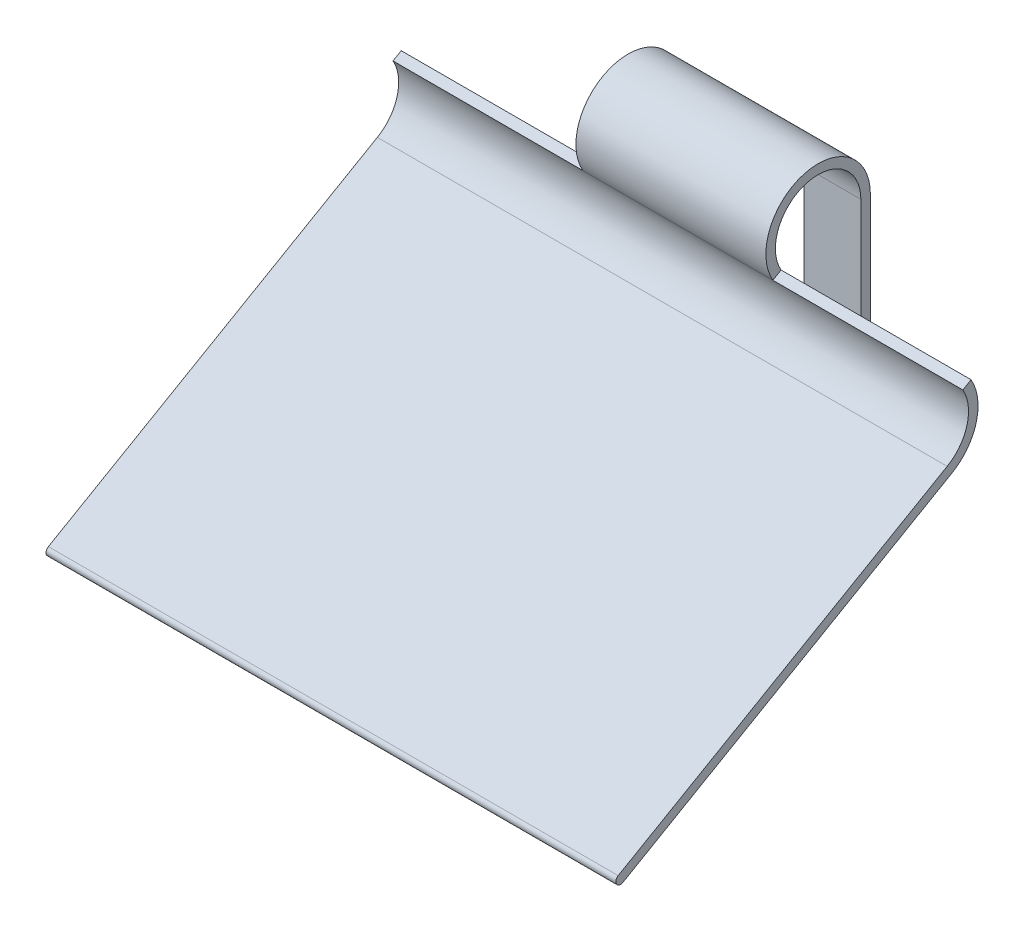
ISO-10303-21;
HEADER;
FILE_DESCRIPTION(('STEP AP214'),'2;1');
FILE_NAME('part.step','',(''),(''),'','','');
FILE_SCHEMA(('AUTOMOTIVE_DESIGN { 1 0 10303 214 1 1 1 1 }'));
ENDSEC;
DATA;
#1=APPLICATION_CONTEXT('core data for automotive mechanical design processes');
#2=APPLICATION_PROTOCOL_DEFINITION('international standard','automotive_design',2000,#1);
#3=PRODUCT_CONTEXT('',#1,'mechanical');
#4=PRODUCT('Part','Part','',(#3));
#5=PRODUCT_RELATED_PRODUCT_CATEGORY('part','',(#4));
#6=PRODUCT_DEFINITION_FORMATION('','',#4);
#7=PRODUCT_DEFINITION_CONTEXT('part definition',#1,'design');
#8=PRODUCT_DEFINITION('design','',#6,#7);
#9=PRODUCT_DEFINITION_SHAPE('','',#8);
#10=(LENGTH_UNIT() NAMED_UNIT(*) SI_UNIT(.MILLI.,.METRE.));
#11=(NAMED_UNIT(*) PLANE_ANGLE_UNIT() SI_UNIT($,.RADIAN.));
#12=(NAMED_UNIT(*) SI_UNIT($,.STERADIAN.) SOLID_ANGLE_UNIT());
#13=UNCERTAINTY_MEASURE_WITH_UNIT(LENGTH_MEASURE(1.E-05),#10,'distance_accuracy_value','');
#14=(GEOMETRIC_REPRESENTATION_CONTEXT(3) GLOBAL_UNCERTAINTY_ASSIGNED_CONTEXT((#13)) GLOBAL_UNIT_ASSIGNED_CONTEXT((#10,
#11,#12)) REPRESENTATION_CONTEXT('',''));
#15=CARTESIAN_POINT('',(0.,0.,0.));
#16=DIRECTION('',(0.,0.,1.));
#17=DIRECTION('',(1.,0.,0.));
#18=AXIS2_PLACEMENT_3D('',#15,#16,#17);
#19=CARTESIAN_POINT('',(-25.4,-50.7985098448101,-28.3470452561249));
#20=DIRECTION('',(1.,0.,0.));
#21=DIRECTION('',(0.,0.,-1.));
#22=AXIS2_PLACEMENT_3D('',#19,#20,#21);
#23=CYLINDRICAL_SURFACE('',#22,1.27);
#24=DIRECTION('',(1.,0.,0.));
#25=VECTOR('',#24,1.);
#26=CARTESIAN_POINT('',(-25.4,-50.7985098448101,-27.0770452561249));
#27=LINE('',#26,#25);
#28=CARTESIAN_POINT('',(10.16,-50.7985098448101,-27.0770452561249));
#29=VERTEX_POINT('',#28);
#30=CARTESIAN_POINT('',(25.4,-50.7985098448101,-27.0770452561249));
#31=VERTEX_POINT('',#30);
#32=EDGE_CURVE('E300',#29,#31,#27,.T.);
#33=ORIENTED_EDGE('',*,*,#32,.F.);
#34=CARTESIAN_POINT('',(10.16,-50.7985098448101,-28.3470452561249));
#35=DIRECTION('',(1.,0.,0.));
#36=DIRECTION('',(0.,1.,0.));
#37=AXIS2_PLACEMENT_3D('',#34,#35,#36);
#38=CIRCLE('',#37,1.27);
#39=CARTESIAN_POINT('',(10.16,-50.7985098448101,-29.6170452561249));
#40=VERTEX_POINT('',#39);
#41=EDGE_CURVE('E317',#29,#40,#38,.T.);
#42=ORIENTED_EDGE('',*,*,#41,.T.);
#43=DIRECTION('',(1.,0.,0.));
#44=VECTOR('',#43,1.);
#45=CARTESIAN_POINT('',(-25.4,-50.7985098448101,-29.6170452561249));
#46=LINE('',#45,#44);
#47=CARTESIAN_POINT('',(25.4,-50.7985098448101,-29.6170452561249));
#48=VERTEX_POINT('',#47);
#49=EDGE_CURVE('E190',#40,#48,#46,.T.);
#50=ORIENTED_EDGE('',*,*,#49,.T.);
#51=CARTESIAN_POINT('',(25.4,-50.7985098448101,-28.3470452561249));
#52=DIRECTION('',(1.,0.,0.));
#53=DIRECTION('',(0.,0.,-1.));
#54=AXIS2_PLACEMENT_3D('',#51,#52,#53);
#55=CIRCLE('',#54,1.27);
#56=EDGE_CURVE('E319',#48,#31,#55,.F.);
#57=ORIENTED_EDGE('',*,*,#56,.T.);
#58=EDGE_LOOP('',(#33,#42,#50,#57));
#59=FACE_BOUND('',#58,.T.);
#60=ADVANCED_FACE('F41',(#59),#23,.T.);
#61=CARTESIAN_POINT('',(-25.4,0.,-27.0770452561249));
#62=DIRECTION('',(0.,0.,1.));
#63=DIRECTION('',(1.,0.,0.));
#64=AXIS2_PLACEMENT_3D('',#61,#62,#63);
#65=PLANE('',#64);
#66=DIRECTION('',(0.,1.,0.));
#67=VECTOR('',#66,1.);
#68=CARTESIAN_POINT('',(10.16,0.,-27.0770452561249));
#69=LINE('',#68,#67);
#70=CARTESIAN_POINT('',(10.16,23.6985226280623,-27.0770452561249));
#71=VERTEX_POINT('',#70);
#72=EDGE_CURVE('E314',#29,#71,#69,.T.);
#73=ORIENTED_EDGE('',*,*,#72,.F.);
#74=ORIENTED_EDGE('',*,*,#32,.T.);
#75=DIRECTION('',(0.,-1.,0.));
#76=VECTOR('',#75,1.);
#77=CARTESIAN_POINT('',(25.4,0.,-27.0770452561249));
#78=LINE('',#77,#76);
#79=CARTESIAN_POINT('',(25.4,23.6985226280623,-27.0770452561249));
#80=VERTEX_POINT('',#79);
#81=EDGE_CURVE('E276',#80,#31,#78,.T.);
#82=ORIENTED_EDGE('',*,*,#81,.F.);
#83=DIRECTION('',(1.,0.,0.));
#84=VECTOR('',#83,1.);
#85=CARTESIAN_POINT('',(-25.4,23.6985226280623,-27.0770452561249));
#86=LINE('',#85,#84);
#87=EDGE_CURVE('E303',#71,#80,#86,.T.);
#88=ORIENTED_EDGE('',*,*,#87,.F.);
#89=EDGE_LOOP('',(#73,#74,#82,#88));
#90=FACE_BOUND('',#89,.T.);
#91=ADVANCED_FACE('F312',(#90),#65,.T.);
#92=CARTESIAN_POINT('',(-25.4,0.,-29.6170452561249));
#93=DIRECTION('',(0.,0.,1.));
#94=DIRECTION('',(1.,0.,0.));
#95=AXIS2_PLACEMENT_3D('',#92,#93,#94);
#96=PLANE('',#95);
#97=ORIENTED_EDGE('',*,*,#49,.F.);
#98=DIRECTION('',(0.,-1.,0.));
#99=VECTOR('',#98,1.);
#100=CARTESIAN_POINT('',(10.16,-50.7985098448101,-29.6170452561249));
#101=LINE('',#100,#99);
#102=CARTESIAN_POINT('',(10.16,23.6985226280623,-29.6170452561249));
#103=VERTEX_POINT('',#102);
#104=EDGE_CURVE('E164',#103,#40,#101,.T.);
#105=ORIENTED_EDGE('',*,*,#104,.F.);
#106=DIRECTION('',(1.,0.,0.));
#107=VECTOR('',#106,1.);
#108=CARTESIAN_POINT('',(-25.4,23.6985226280623,-29.6170452561249));
#109=LINE('',#108,#107);
#110=CARTESIAN_POINT('',(25.4,23.6985226280623,-29.6170452561249));
#111=VERTEX_POINT('',#110);
#112=EDGE_CURVE('E178',#103,#111,#109,.T.);
#113=ORIENTED_EDGE('',*,*,#112,.T.);
#114=DIRECTION('',(0.,-1.,0.));
#115=VECTOR('',#114,1.);
#116=CARTESIAN_POINT('',(25.4,0.,-29.6170452561249));
#117=LINE('',#116,#115);
#118=EDGE_CURVE('E278',#111,#48,#117,.T.);
#119=ORIENTED_EDGE('',*,*,#118,.T.);
#120=EDGE_LOOP('',(#97,#105,#113,#119));
#121=FACE_BOUND('',#120,.T.);
#122=ADVANCED_FACE('F334',(#121),#96,.F.);
#123=CARTESIAN_POINT('',(-76.2,10.9985226280624,6.34999999999994));
#124=DIRECTION('',(0.,-0.866025403784442,-0.499999999999995));
#125=DIRECTION('',(0.,0.499999999999995,-0.866025403784442));
#126=AXIS2_PLACEMENT_3D('',#123,#124,#125);
#127=PLANE('',#126);
#128=DIRECTION('',(0.,0.499999999999995,-0.866025403784442));
#129=VECTOR('',#128,1.);
#130=CARTESIAN_POINT('',(-25.4,10.9985226280624,6.34999999999994));
#131=LINE('',#130,#129);
#132=CARTESIAN_POINT('',(-25.4,16.7135226280624,-3.54867036525622));
#133=VERTEX_POINT('',#132);
#134=CARTESIAN_POINT('',(-25.4,17.9835226280623,-5.74837489086871));
#135=VERTEX_POINT('',#134);
#136=EDGE_CURVE('E289',#133,#135,#131,.T.);
#137=ORIENTED_EDGE('',*,*,#136,.T.);
#138=DIRECTION('',(1.,0.,0.));
#139=VECTOR('',#138,1.);
#140=CARTESIAN_POINT('',(-76.2,17.9835226280623,-5.74837489086871));
#141=LINE('',#140,#139);
#142=CARTESIAN_POINT('',(-76.2,17.9835226280623,-5.74837489086871));
#143=VERTEX_POINT('',#142);
#144=EDGE_CURVE('E231',#143,#135,#141,.T.);
#145=ORIENTED_EDGE('',*,*,#144,.F.);
#146=DIRECTION('',(0.,0.499999999999995,-0.866025403784442));
#147=VECTOR('',#146,1.);
#148=CARTESIAN_POINT('',(-76.2,10.9985226280624,6.34999999999994));
#149=LINE('',#148,#147);
#150=CARTESIAN_POINT('',(-76.2,16.7135226280624,-3.54867036525622));
#151=VERTEX_POINT('',#150);
#152=EDGE_CURVE('E221',#151,#143,#149,.T.);
#153=ORIENTED_EDGE('',*,*,#152,.F.);
#154=DIRECTION('',(1.,0.,0.));
#155=VECTOR('',#154,1.);
#156=CARTESIAN_POINT('',(-76.2,16.7135226280624,-3.54867036525622));
#157=LINE('',#156,#155);
#158=EDGE_CURVE('E227',#151,#133,#157,.T.);
#159=ORIENTED_EDGE('',*,*,#158,.T.);
#160=EDGE_LOOP('',(#137,#145,#153,#159));
#161=FACE_BOUND('',#160,.T.);
#162=ADVANCED_FACE('F337',(#161),#127,.F.);
#163=CARTESIAN_POINT('',(-76.2,1.09985226280624,0.635));
#164=DIRECTION('',(0.,0.866025403784439,0.5));
#165=DIRECTION('',(0.,-0.5,0.866025403784439));
#166=AXIS2_PLACEMENT_3D('',#163,#164,#165);
#167=PLANE('',#166);
#168=DIRECTION('',(1.,0.,0.));
#169=VECTOR('',#168,1.);
#170=CARTESIAN_POINT('',(-76.2,-49.6986575820043,88.6205999999997));
#171=LINE('',#170,#169);
#172=CARTESIAN_POINT('',(-76.2,-49.6986575820043,88.6205999999997));
#173=VERTEX_POINT('',#172);
#174=CARTESIAN_POINT('',(76.2,-49.6986575820043,88.6205999999997));
#175=VERTEX_POINT('',#174);
#176=EDGE_CURVE('E225',#173,#175,#171,.T.);
#177=ORIENTED_EDGE('',*,*,#176,.T.);
#178=DIRECTION('',(0.,-0.5,0.866025403784439));
#179=VECTOR('',#178,1.);
#180=CARTESIAN_POINT('',(76.2,1.09985226280624,0.635));
#181=LINE('',#180,#179);
#182=CARTESIAN_POINT('',(76.2,1.09985226280624,0.634999999999997));
#183=VERTEX_POINT('',#182);
#184=EDGE_CURVE('E191',#183,#175,#181,.T.);
#185=ORIENTED_EDGE('',*,*,#184,.F.);
#186=DIRECTION('',(1.,0.,0.));
#187=VECTOR('',#186,1.);
#188=CARTESIAN_POINT('',(-76.2,1.09985226280624,0.634999999999997));
#189=LINE('',#188,#187);
#190=CARTESIAN_POINT('',(-76.2,1.09985226280624,0.634999999999997));
#191=VERTEX_POINT('',#190);
#192=EDGE_CURVE('E49',#191,#183,#189,.T.);
#193=ORIENTED_EDGE('',*,*,#192,.F.);
#194=DIRECTION('',(0.,-0.5,0.866025403784439));
#195=VECTOR('',#194,1.);
#196=CARTESIAN_POINT('',(-76.2,1.09985226280624,0.635));
#197=LINE('',#196,#195);
#198=EDGE_CURVE('E210',#191,#173,#197,.T.);
#199=ORIENTED_EDGE('',*,*,#198,.T.);
#200=EDGE_LOOP('',(#177,#185,#193,#199));
#201=FACE_BOUND('',#200,.T.);
#202=ADVANCED_FACE('F43',(#201),#167,.T.);
#203=CARTESIAN_POINT('',(-76.2,10.9985226280624,6.34999999999994));
#204=DIRECTION('',(1.,0.,0.));
#205=DIRECTION('',(0.,0.,-1.));
#206=AXIS2_PLACEMENT_3D('',#203,#204,#205);
#207=CYLINDRICAL_SURFACE('',#206,11.43);
#208=ORIENTED_EDGE('',*,*,#192,.T.);
#209=CARTESIAN_POINT('',(76.2,10.9985226280624,6.34999999999994));
#210=DIRECTION('',(1.,0.,0.));
#211=DIRECTION('',(0.,0.,-1.));
#212=AXIS2_PLACEMENT_3D('',#209,#210,#211);
#213=CIRCLE('',#212,11.43);
#214=CARTESIAN_POINT('',(76.2,16.7135226280624,-3.54867036525622));
#215=VERTEX_POINT('',#214);
#216=EDGE_CURVE('E207',#183,#215,#213,.T.);
#217=ORIENTED_EDGE('',*,*,#216,.T.);
#218=CARTESIAN_POINT('',(25.4,16.7135226280624,-3.54867036525622));
#219=VERTEX_POINT('',#218);
#220=EDGE_CURVE('E230',#219,#215,#157,.T.);
#221=ORIENTED_EDGE('',*,*,#220,.F.);
#222=DIRECTION('',(1.,0.,0.));
#223=VECTOR('',#222,1.);
#224=CARTESIAN_POINT('',(-25.4,16.7135226280624,-3.54867036525622));
#225=LINE('',#224,#223);
#226=EDGE_CURVE('E182',#133,#219,#225,.T.);
#227=ORIENTED_EDGE('',*,*,#226,.F.);
#228=ORIENTED_EDGE('',*,*,#158,.F.);
#229=CARTESIAN_POINT('',(-76.2,10.9985226280624,6.34999999999994));
#230=DIRECTION('',(1.,0.,0.));
#231=DIRECTION('',(0.,0.,-1.));
#232=AXIS2_PLACEMENT_3D('',#229,#230,#231);
#233=CIRCLE('',#232,11.43);
#234=EDGE_CURVE('E223',#191,#151,#233,.T.);
#235=ORIENTED_EDGE('',*,*,#234,.F.);
#236=EDGE_LOOP('',(#208,#217,#221,#227,#228,#235));
#237=FACE_BOUND('',#236,.T.);
#238=ADVANCED_FACE('F253',(#237),#207,.F.);
#239=CARTESIAN_POINT('',(25.4,17.9835226280623,-5.74837489086871));
#240=VERTEX_POINT('',#239);
#241=CARTESIAN_POINT('',(76.2,17.9835226280623,-5.74837489086871));
#242=VERTEX_POINT('',#241);
#243=EDGE_CURVE('E234',#240,#242,#141,.T.);
#244=ORIENTED_EDGE('',*,*,#243,.F.);
#245=DIRECTION('',(0.,0.499999999999995,-0.866025403784442));
#246=VECTOR('',#245,1.);
#247=CARTESIAN_POINT('',(25.4,10.9985226280624,6.34999999999994));
#248=LINE('',#247,#246);
#249=EDGE_CURVE('E271',#219,#240,#248,.T.);
#250=ORIENTED_EDGE('',*,*,#249,.F.);
#251=ORIENTED_EDGE('',*,*,#220,.T.);
#252=DIRECTION('',(0.,0.499999999999995,-0.866025403784442));
#253=VECTOR('',#252,1.);
#254=CARTESIAN_POINT('',(76.2,10.9985226280624,6.34999999999994));
#255=LINE('',#254,#253);
#256=EDGE_CURVE('E204',#215,#242,#255,.T.);
#257=ORIENTED_EDGE('',*,*,#256,.T.);
#258=EDGE_LOOP('',(#244,#250,#251,#257));
#259=FACE_BOUND('',#258,.T.);
#260=ADVANCED_FACE('F268',(#259),#127,.F.);
#261=CARTESIAN_POINT('',(-76.2,10.9985226280624,6.34999999999994));
#262=DIRECTION('',(1.,0.,0.));
#263=DIRECTION('',(0.,0.,-1.));
#264=AXIS2_PLACEMENT_3D('',#261,#262,#263);
#265=CYLINDRICAL_SURFACE('',#264,13.97);
#266=ORIENTED_EDGE('',*,*,#144,.T.);
#267=DIRECTION('',(1.,0.,0.));
#268=VECTOR('',#267,1.);
#269=CARTESIAN_POINT('',(-25.4,17.9835226280623,-5.74837489086871));
#270=LINE('',#269,#268);
#271=EDGE_CURVE('E184',#135,#240,#270,.T.);
#272=ORIENTED_EDGE('',*,*,#271,.T.);
#273=ORIENTED_EDGE('',*,*,#243,.T.);
#274=CARTESIAN_POINT('',(76.2,10.9985226280624,6.34999999999994));
#275=DIRECTION('',(1.,0.,0.));
#276=DIRECTION('',(0.,0.,-1.));
#277=AXIS2_PLACEMENT_3D('',#274,#275,#276);
#278=CIRCLE('',#277,13.97);
#279=CARTESIAN_POINT('',(76.2,-1.09985226280624,-0.63499999999999));
#280=VERTEX_POINT('',#279);
#281=EDGE_CURVE('E201',#280,#242,#278,.T.);
#282=ORIENTED_EDGE('',*,*,#281,.F.);
#283=DIRECTION('',(1.,0.,0.));
#284=VECTOR('',#283,1.);
#285=CARTESIAN_POINT('',(-76.2,-1.09985226280624,-0.63499999999999));
#286=LINE('',#285,#284);
#287=CARTESIAN_POINT('',(-76.2,-1.09985226280624,-0.63499999999999));
#288=VERTEX_POINT('',#287);
#289=EDGE_CURVE('E235',#288,#280,#286,.T.);
#290=ORIENTED_EDGE('',*,*,#289,.F.);
#291=CARTESIAN_POINT('',(-76.2,10.9985226280624,6.34999999999994));
#292=DIRECTION('',(1.,0.,0.));
#293=DIRECTION('',(0.,0.,-1.));
#294=AXIS2_PLACEMENT_3D('',#291,#292,#293);
#295=CIRCLE('',#294,13.97);
#296=EDGE_CURVE('E218',#288,#143,#295,.T.);
#297=ORIENTED_EDGE('',*,*,#296,.T.);
#298=EDGE_LOOP('',(#266,#272,#273,#282,#290,#297));
#299=FACE_BOUND('',#298,.T.);
#300=ADVANCED_FACE('F339',(#299),#265,.T.);
#301=CARTESIAN_POINT('',(-76.2,-1.09985226280624,-0.635));
#302=DIRECTION('',(0.,0.866025403784439,0.5));
#303=DIRECTION('',(0.,-0.5,0.866025403784439));
#304=AXIS2_PLACEMENT_3D('',#301,#302,#303);
#305=PLANE('',#304);
#306=ORIENTED_EDGE('',*,*,#289,.T.);
#307=DIRECTION('',(0.,-0.5,0.866025403784439));
#308=VECTOR('',#307,1.);
#309=CARTESIAN_POINT('',(76.2,-1.09985226280624,-0.635));
#310=LINE('',#309,#308);
#311=CARTESIAN_POINT('',(76.2,-51.8983621076168,87.3505999999997));
#312=VERTEX_POINT('',#311);
#313=EDGE_CURVE('E198',#280,#312,#310,.T.);
#314=ORIENTED_EDGE('',*,*,#313,.T.);
#315=DIRECTION('',(1.,0.,0.));
#316=VECTOR('',#315,1.);
#317=CARTESIAN_POINT('',(-76.2,-51.8983621076168,87.3505999999997));
#318=LINE('',#317,#316);
#319=CARTESIAN_POINT('',(-76.2,-51.8983621076168,87.3505999999997));
#320=VERTEX_POINT('',#319);
#321=EDGE_CURVE('E237',#320,#312,#318,.T.);
#322=ORIENTED_EDGE('',*,*,#321,.F.);
#323=DIRECTION('',(0.,-0.5,0.866025403784439));
#324=VECTOR('',#323,1.);
#325=CARTESIAN_POINT('',(-76.2,-1.09985226280624,-0.635));
#326=LINE('',#325,#324);
#327=EDGE_CURVE('E216',#288,#320,#326,.T.);
#328=ORIENTED_EDGE('',*,*,#327,.F.);
#329=EDGE_LOOP('',(#306,#314,#322,#328));
#330=FACE_BOUND('',#329,.T.);
#331=ADVANCED_FACE('F263',(#330),#305,.F.);
#332=CARTESIAN_POINT('',(-76.2,-50.7985098448101,87.9856));
#333=DIRECTION('',(1.,0.,0.));
#334=DIRECTION('',(0.,0.,-1.));
#335=AXIS2_PLACEMENT_3D('',#332,#333,#334);
#336=CYLINDRICAL_SURFACE('',#335,1.27);
#337=ORIENTED_EDGE('',*,*,#321,.T.);
#338=CARTESIAN_POINT('',(76.2,-50.7985098448101,87.9856));
#339=DIRECTION('',(1.,0.,0.));
#340=DIRECTION('',(0.,0.,-1.));
#341=AXIS2_PLACEMENT_3D('',#338,#339,#340);
#342=CIRCLE('',#341,1.27);
#343=EDGE_CURVE('E194',#175,#312,#342,.T.);
#344=ORIENTED_EDGE('',*,*,#343,.F.);
#345=ORIENTED_EDGE('',*,*,#176,.F.);
#346=CARTESIAN_POINT('',(-76.2,-50.7985098448101,87.9856));
#347=DIRECTION('',(1.,0.,0.));
#348=DIRECTION('',(0.,0.,-1.));
#349=AXIS2_PLACEMENT_3D('',#346,#347,#348);
#350=CIRCLE('',#349,1.27);
#351=EDGE_CURVE('E213',#173,#320,#350,.T.);
#352=ORIENTED_EDGE('',*,*,#351,.T.);
#353=EDGE_LOOP('',(#337,#344,#345,#352));
#354=FACE_BOUND('',#353,.T.);
#355=ADVANCED_FACE('F245',(#354),#336,.T.);
#356=CARTESIAN_POINT('',(-76.2,0.,0.));
#357=DIRECTION('',(1.,0.,0.));
#358=DIRECTION('',(0.,0.,-1.));
#359=AXIS2_PLACEMENT_3D('',#356,#357,#358);
#360=PLANE('',#359);
#361=ORIENTED_EDGE('',*,*,#198,.F.);
#362=ORIENTED_EDGE('',*,*,#234,.T.);
#363=ORIENTED_EDGE('',*,*,#152,.T.);
#364=ORIENTED_EDGE('',*,*,#296,.F.);
#365=ORIENTED_EDGE('',*,*,#327,.T.);
#366=ORIENTED_EDGE('',*,*,#351,.F.);
#367=EDGE_LOOP('',(#361,#362,#363,#364,#365,#366));
#368=FACE_BOUND('',#367,.T.);
#369=ADVANCED_FACE('F259',(#368),#360,.F.);
#370=CARTESIAN_POINT('',(76.2,0.,0.));
#371=DIRECTION('',(1.,0.,0.));
#372=DIRECTION('',(0.,0.,-1.));
#373=AXIS2_PLACEMENT_3D('',#370,#371,#372);
#374=PLANE('',#373);
#375=ORIENTED_EDGE('',*,*,#184,.T.);
#376=ORIENTED_EDGE('',*,*,#343,.T.);
#377=ORIENTED_EDGE('',*,*,#313,.F.);
#378=ORIENTED_EDGE('',*,*,#281,.T.);
#379=ORIENTED_EDGE('',*,*,#256,.F.);
#380=ORIENTED_EDGE('',*,*,#216,.F.);
#381=EDGE_LOOP('',(#375,#376,#377,#378,#379,#380));
#382=FACE_BOUND('',#381,.T.);
#383=ADVANCED_FACE('F249',(#382),#374,.T.);
#384=CARTESIAN_POINT('',(-25.4,-50.7985098448101,-29.6170452561249));
#385=VERTEX_POINT('',#384);
#386=CARTESIAN_POINT('',(-10.16,-50.7985098448101,-29.6170452561249));
#387=VERTEX_POINT('',#386);
#388=EDGE_CURVE('E186',#385,#387,#46,.T.);
#389=ORIENTED_EDGE('',*,*,#388,.T.);
#390=CARTESIAN_POINT('',(-10.16,-50.7985098448101,-28.3470452561249));
#391=DIRECTION('',(-1.,0.,0.));
#392=DIRECTION('',(0.,-1.,0.));
#393=AXIS2_PLACEMENT_3D('',#390,#391,#392);
#394=CIRCLE('',#393,1.27);
#395=CARTESIAN_POINT('',(-10.16,-50.7985098448101,-27.0770452561249));
#396=VERTEX_POINT('',#395);
#397=EDGE_CURVE('E56',#387,#396,#394,.T.);
#398=ORIENTED_EDGE('',*,*,#397,.T.);
#399=CARTESIAN_POINT('',(-25.4,-50.7985098448101,-27.0770452561249));
#400=VERTEX_POINT('',#399);
#401=EDGE_CURVE('E195',#400,#396,#27,.T.);
#402=ORIENTED_EDGE('',*,*,#401,.F.);
#403=CARTESIAN_POINT('',(-25.4,-50.7985098448101,-28.3470452561249));
#404=DIRECTION('',(1.,0.,0.));
#405=DIRECTION('',(0.,0.,-1.));
#406=AXIS2_PLACEMENT_3D('',#403,#404,#405);
#407=CIRCLE('',#406,1.27);
#408=EDGE_CURVE('E284',#385,#400,#407,.F.);
#409=ORIENTED_EDGE('',*,*,#408,.F.);
#410=EDGE_LOOP('',(#389,#398,#402,#409));
#411=FACE_BOUND('',#410,.T.);
#412=ADVANCED_FACE('F351',(#411),#23,.T.);
#413=DIRECTION('',(0.,-1.,0.));
#414=VECTOR('',#413,1.);
#415=CARTESIAN_POINT('',(-10.16,0.,-27.0770452561249));
#416=LINE('',#415,#414);
#417=CARTESIAN_POINT('',(-10.16,23.6985226280623,-27.0770452561249));
#418=VERTEX_POINT('',#417);
#419=EDGE_CURVE('E328',#418,#396,#416,.T.);
#420=ORIENTED_EDGE('',*,*,#419,.F.);
#421=CARTESIAN_POINT('',(-25.4,23.6985226280623,-27.0770452561249));
#422=VERTEX_POINT('',#421);
#423=EDGE_CURVE('E301',#422,#418,#86,.T.);
#424=ORIENTED_EDGE('',*,*,#423,.F.);
#425=DIRECTION('',(0.,-1.,0.));
#426=VECTOR('',#425,1.);
#427=CARTESIAN_POINT('',(-25.4,0.,-27.0770452561249));
#428=LINE('',#427,#426);
#429=EDGE_CURVE('E295',#422,#400,#428,.T.);
#430=ORIENTED_EDGE('',*,*,#429,.T.);
#431=ORIENTED_EDGE('',*,*,#401,.T.);
#432=EDGE_LOOP('',(#420,#424,#430,#431));
#433=FACE_BOUND('',#432,.T.);
#434=ADVANCED_FACE('F357',(#433),#65,.T.);
#435=CARTESIAN_POINT('',(-25.4,23.6985226280623,-15.6470452561249));
#436=DIRECTION('',(1.,0.,0.));
#437=DIRECTION('',(0.,0.,-1.));
#438=AXIS2_PLACEMENT_3D('',#435,#436,#437);
#439=CYLINDRICAL_SURFACE('',#438,11.43);
#440=ORIENTED_EDGE('',*,*,#423,.T.);
#441=DIRECTION('',(1.,0.,0.));
#442=VECTOR('',#441,1.);
#443=CARTESIAN_POINT('',(-25.4,23.6985226280623,-27.0770452561249));
#444=LINE('',#443,#442);
#445=EDGE_CURVE('E161',#71,#418,#444,.F.);
#446=ORIENTED_EDGE('',*,*,#445,.F.);
#447=ORIENTED_EDGE('',*,*,#87,.T.);
#448=CARTESIAN_POINT('',(25.4,23.6985226280623,-15.6470452561249));
#449=DIRECTION('',(1.,0.,0.));
#450=DIRECTION('',(0.,0.,-1.));
#451=AXIS2_PLACEMENT_3D('',#448,#449,#450);
#452=CIRCLE('',#451,11.43);
#453=EDGE_CURVE('E63',#240,#80,#452,.F.);
#454=ORIENTED_EDGE('',*,*,#453,.F.);
#455=ORIENTED_EDGE('',*,*,#271,.F.);
#456=CARTESIAN_POINT('',(-25.4,23.6985226280623,-15.6470452561249));
#457=DIRECTION('',(1.,0.,0.));
#458=DIRECTION('',(0.,0.,-1.));
#459=AXIS2_PLACEMENT_3D('',#456,#457,#458);
#460=CIRCLE('',#459,11.43);
#461=EDGE_CURVE('E292',#135,#422,#460,.F.);
#462=ORIENTED_EDGE('',*,*,#461,.T.);
#463=EDGE_LOOP('',(#440,#446,#447,#454,#455,#462));
#464=FACE_BOUND('',#463,.T.);
#465=ADVANCED_FACE('F305',(#464),#439,.F.);
#466=CARTESIAN_POINT('',(-25.4,23.6985226280623,-15.6470452561249));
#467=DIRECTION('',(1.,0.,0.));
#468=DIRECTION('',(0.,0.,-1.));
#469=AXIS2_PLACEMENT_3D('',#466,#467,#468);
#470=CYLINDRICAL_SURFACE('',#469,13.97);
#471=ORIENTED_EDGE('',*,*,#226,.T.);
#472=CARTESIAN_POINT('',(25.4,23.6985226280623,-15.6470452561249));
#473=DIRECTION('',(1.,0.,0.));
#474=DIRECTION('',(0.,0.,-1.));
#475=AXIS2_PLACEMENT_3D('',#472,#473,#474);
#476=CIRCLE('',#475,13.97);
#477=EDGE_CURVE('E274',#219,#111,#476,.F.);
#478=ORIENTED_EDGE('',*,*,#477,.T.);
#479=ORIENTED_EDGE('',*,*,#112,.F.);
#480=DIRECTION('',(1.,0.,0.));
#481=VECTOR('',#480,1.);
#482=CARTESIAN_POINT('',(10.16,23.6985226280623,-29.6170452561249));
#483=LINE('',#482,#481);
#484=CARTESIAN_POINT('',(-10.16,23.6985226280623,-29.6170452561249));
#485=VERTEX_POINT('',#484);
#486=EDGE_CURVE('E158',#485,#103,#483,.T.);
#487=ORIENTED_EDGE('',*,*,#486,.F.);
#488=CARTESIAN_POINT('',(-25.4,23.6985226280623,-29.6170452561249));
#489=VERTEX_POINT('',#488);
#490=EDGE_CURVE('E175',#489,#485,#109,.T.);
#491=ORIENTED_EDGE('',*,*,#490,.F.);
#492=CARTESIAN_POINT('',(-25.4,23.6985226280623,-15.6470452561249));
#493=DIRECTION('',(1.,0.,0.));
#494=DIRECTION('',(0.,0.,-1.));
#495=AXIS2_PLACEMENT_3D('',#492,#493,#494);
#496=CIRCLE('',#495,13.97);
#497=EDGE_CURVE('E287',#133,#489,#496,.F.);
#498=ORIENTED_EDGE('',*,*,#497,.F.);
#499=EDGE_LOOP('',(#471,#478,#479,#487,#491,#498));
#500=FACE_BOUND('',#499,.T.);
#501=ADVANCED_FACE('F174',(#500),#470,.T.);
#502=ORIENTED_EDGE('',*,*,#490,.T.);
#503=DIRECTION('',(0.,-1.,0.));
#504=VECTOR('',#503,1.);
#505=CARTESIAN_POINT('',(-10.16,0.,-29.6170452561249));
#506=LINE('',#505,#504);
#507=EDGE_CURVE('E11',#485,#387,#506,.T.);
#508=ORIENTED_EDGE('',*,*,#507,.T.);
#509=ORIENTED_EDGE('',*,*,#388,.F.);
#510=DIRECTION('',(0.,-1.,0.));
#511=VECTOR('',#510,1.);
#512=CARTESIAN_POINT('',(-25.4,0.,-29.6170452561249));
#513=LINE('',#512,#511);
#514=EDGE_CURVE('E181',#489,#385,#513,.T.);
#515=ORIENTED_EDGE('',*,*,#514,.F.);
#516=EDGE_LOOP('',(#502,#508,#509,#515));
#517=FACE_BOUND('',#516,.T.);
#518=ADVANCED_FACE('F180',(#517),#96,.F.);
#519=CARTESIAN_POINT('',(-25.4,0.,0.));
#520=DIRECTION('',(1.,0.,0.));
#521=DIRECTION('',(0.,0.,-1.));
#522=AXIS2_PLACEMENT_3D('',#519,#520,#521);
#523=PLANE('',#522);
#524=ORIENTED_EDGE('',*,*,#408,.T.);
#525=ORIENTED_EDGE('',*,*,#429,.F.);
#526=ORIENTED_EDGE('',*,*,#461,.F.);
#527=ORIENTED_EDGE('',*,*,#136,.F.);
#528=ORIENTED_EDGE('',*,*,#497,.T.);
#529=ORIENTED_EDGE('',*,*,#514,.T.);
#530=EDGE_LOOP('',(#524,#525,#526,#527,#528,#529));
#531=FACE_BOUND('',#530,.T.);
#532=ADVANCED_FACE('F372',(#531),#523,.F.);
#533=CARTESIAN_POINT('',(25.4,0.,0.));
#534=DIRECTION('',(1.,0.,0.));
#535=DIRECTION('',(0.,0.,-1.));
#536=AXIS2_PLACEMENT_3D('',#533,#534,#535);
#537=PLANE('',#536);
#538=ORIENTED_EDGE('',*,*,#56,.F.);
#539=ORIENTED_EDGE('',*,*,#118,.F.);
#540=ORIENTED_EDGE('',*,*,#477,.F.);
#541=ORIENTED_EDGE('',*,*,#249,.T.);
#542=ORIENTED_EDGE('',*,*,#453,.T.);
#543=ORIENTED_EDGE('',*,*,#81,.T.);
#544=EDGE_LOOP('',(#538,#539,#540,#541,#542,#543));
#545=FACE_BOUND('',#544,.T.);
#546=ADVANCED_FACE('F310',(#545),#537,.T.);
#547=CARTESIAN_POINT('',(10.16,-50.7985098448101,-25.8070452561249));
#548=DIRECTION('',(1.,0.,0.));
#549=DIRECTION('',(0.,1.,0.));
#550=AXIS2_PLACEMENT_3D('',#547,#548,#549);
#551=PLANE('',#550);
#552=ORIENTED_EDGE('',*,*,#72,.T.);
#553=DIRECTION('',(0.,0.,-1.));
#554=VECTOR('',#553,1.);
#555=CARTESIAN_POINT('',(10.16,23.6985226280623,-25.8070452561249));
#556=LINE('',#555,#554);
#557=EDGE_CURVE('E163',#71,#103,#556,.T.);
#558=ORIENTED_EDGE('',*,*,#557,.T.);
#559=ORIENTED_EDGE('',*,*,#104,.T.);
#560=ORIENTED_EDGE('',*,*,#41,.F.);
#561=EDGE_LOOP('',(#552,#558,#559,#560));
#562=FACE_BOUND('',#561,.T.);
#563=ADVANCED_FACE('F332',(#562),#551,.F.);
#564=CARTESIAN_POINT('',(-10.16,-50.7985098448101,-25.8070452561249));
#565=DIRECTION('',(-1.,0.,0.));
#566=DIRECTION('',(0.,-1.,0.));
#567=AXIS2_PLACEMENT_3D('',#564,#565,#566);
#568=PLANE('',#567);
#569=ORIENTED_EDGE('',*,*,#507,.F.);
#570=DIRECTION('',(0.,0.,-1.));
#571=VECTOR('',#570,1.);
#572=CARTESIAN_POINT('',(-10.16,23.6985226280623,-25.8070452561249));
#573=LINE('',#572,#571);
#574=EDGE_CURVE('E154',#418,#485,#573,.T.);
#575=ORIENTED_EDGE('',*,*,#574,.F.);
#576=ORIENTED_EDGE('',*,*,#419,.T.);
#577=ORIENTED_EDGE('',*,*,#397,.F.);
#578=EDGE_LOOP('',(#569,#575,#576,#577));
#579=FACE_BOUND('',#578,.T.);
#580=ADVANCED_FACE('F166',(#579),#568,.F.);
#581=CARTESIAN_POINT('',(10.16,23.6985226280623,-25.8070452561249));
#582=DIRECTION('',(0.,1.,0.));
#583=DIRECTION('',(-1.,0.,0.));
#584=AXIS2_PLACEMENT_3D('',#581,#582,#583);
#585=PLANE('',#584);
#586=ORIENTED_EDGE('',*,*,#445,.T.);
#587=ORIENTED_EDGE('',*,*,#574,.T.);
#588=ORIENTED_EDGE('',*,*,#486,.T.);
#589=ORIENTED_EDGE('',*,*,#557,.F.);
#590=EDGE_LOOP('',(#586,#587,#588,#589));
#591=FACE_BOUND('',#590,.T.);
#592=ADVANCED_FACE('F155',(#591),#585,.F.);
#593=CLOSED_SHELL('',(#60,#91,#122,#162,#202,#238,#260,#300,#331,#355,#369,#383,#412,#434,#465,
#501,#518,#532,#546,#563,#580,#592));
#594=MANIFOLD_SOLID_BREP('B2',#593);
#595=ADVANCED_BREP_SHAPE_REPRESENTATION('',(#18,#594),#14);
#596=SHAPE_DEFINITION_REPRESENTATION(#9,#595);
ENDSEC;
END-ISO-10303-21;
